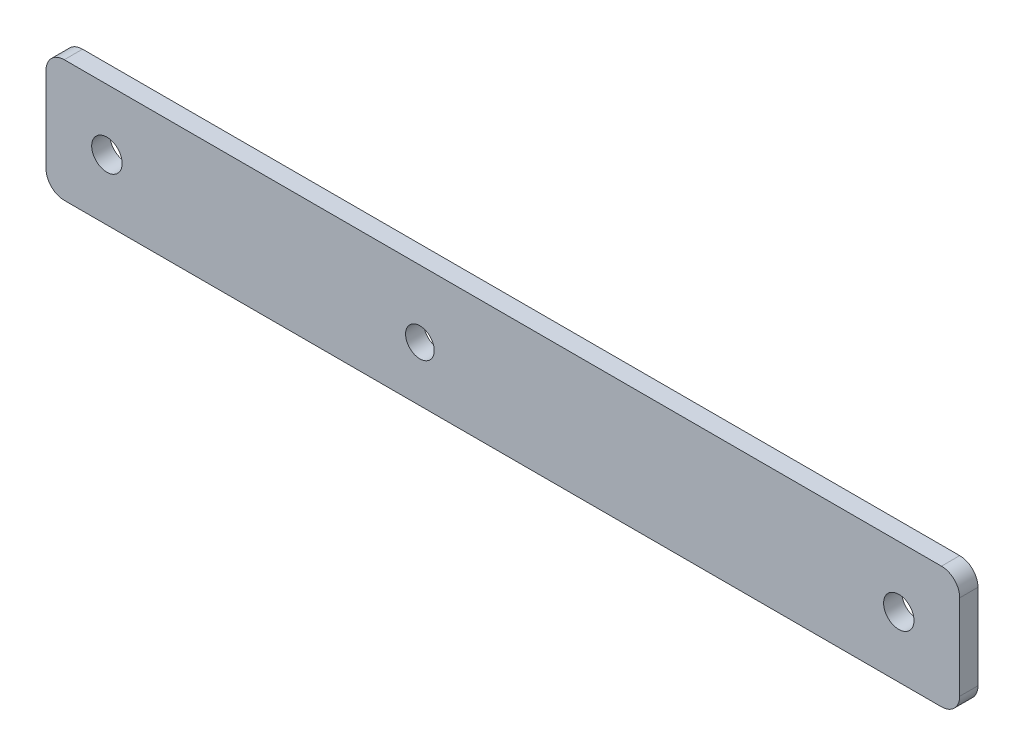
ISO-10303-21;
HEADER;
FILE_DESCRIPTION(('STEP AP214'),'2;1');
FILE_NAME('part.step','',(''),(''),'','','');
FILE_SCHEMA(('AUTOMOTIVE_DESIGN { 1 0 10303 214 1 1 1 1 }'));
ENDSEC;
DATA;
#1=APPLICATION_CONTEXT('core data for automotive mechanical design processes');
#2=APPLICATION_PROTOCOL_DEFINITION('international standard','automotive_design',2000,#1);
#3=PRODUCT_CONTEXT('',#1,'mechanical');
#4=PRODUCT('Part','Part','',(#3));
#5=PRODUCT_RELATED_PRODUCT_CATEGORY('part','',(#4));
#6=PRODUCT_DEFINITION_FORMATION('','',#4);
#7=PRODUCT_DEFINITION_CONTEXT('part definition',#1,'design');
#8=PRODUCT_DEFINITION('design','',#6,#7);
#9=PRODUCT_DEFINITION_SHAPE('','',#8);
#10=(LENGTH_UNIT() NAMED_UNIT(*) SI_UNIT(.MILLI.,.METRE.));
#11=(NAMED_UNIT(*) PLANE_ANGLE_UNIT() SI_UNIT($,.RADIAN.));
#12=(NAMED_UNIT(*) SI_UNIT($,.STERADIAN.) SOLID_ANGLE_UNIT());
#13=UNCERTAINTY_MEASURE_WITH_UNIT(LENGTH_MEASURE(1.E-05),#10,'distance_accuracy_value','');
#14=(GEOMETRIC_REPRESENTATION_CONTEXT(3) GLOBAL_UNCERTAINTY_ASSIGNED_CONTEXT((#13)) GLOBAL_UNIT_ASSIGNED_CONTEXT((#10,
#11,#12)) REPRESENTATION_CONTEXT('',''));
#15=CARTESIAN_POINT('',(0.,0.,0.));
#16=DIRECTION('',(0.,0.,1.));
#17=DIRECTION('',(1.,0.,0.));
#18=AXIS2_PLACEMENT_3D('',#15,#16,#17);
#19=CARTESIAN_POINT('',(0.,0.,3.));
#20=DIRECTION('',(0.,0.,1.));
#21=DIRECTION('',(1.,0.,0.));
#22=AXIS2_PLACEMENT_3D('',#19,#20,#21);
#23=PLANE('',#22);
#24=CARTESIAN_POINT('',(21.3812835358271,49.0134935367063,3.));
#25=DIRECTION('',(0.,0.,1.));
#26=DIRECTION('',(1.,0.,0.));
#27=AXIS2_PLACEMENT_3D('',#24,#25,#26);
#28=CIRCLE('',#27,2.35350192298621);
#29=CARTESIAN_POINT('',(23.7347854588133,49.0134935367063,3.));
#30=VERTEX_POINT('',#29);
#31=EDGE_CURVE('E192',#30,#30,#28,.T.);
#32=ORIENTED_EDGE('',*,*,#31,.F.);
#33=EDGE_LOOP('',(#32));
#34=FACE_BOUND('',#33,.T.);
#35=CARTESIAN_POINT('',(-30.,50.,3.));
#36=DIRECTION('',(0.,0.,1.));
#37=DIRECTION('',(1.,0.,0.));
#38=AXIS2_PLACEMENT_3D('',#35,#36,#37);
#39=CIRCLE('',#38,2.5);
#40=CARTESIAN_POINT('',(-27.5,50.,3.));
#41=VERTEX_POINT('',#40);
#42=EDGE_CURVE('E131',#41,#41,#39,.T.);
#43=ORIENTED_EDGE('',*,*,#42,.F.);
#44=EDGE_LOOP('',(#43));
#45=FACE_BOUND('',#44,.T.);
#46=DIRECTION('',(1.,0.,0.));
#47=VECTOR('',#46,1.);
#48=CARTESIAN_POINT('',(-40.,40.,3.));
#49=LINE('',#48,#47);
#50=CARTESIAN_POINT('',(-37.,40.,3.));
#51=VERTEX_POINT('',#50);
#52=CARTESIAN_POINT('',(107.,40.,3.));
#53=VERTEX_POINT('',#52);
#54=EDGE_CURVE('E140',#51,#53,#49,.T.);
#55=ORIENTED_EDGE('',*,*,#54,.T.);
#56=CARTESIAN_POINT('',(107.,43.,3.));
#57=DIRECTION('',(0.,0.,1.));
#58=DIRECTION('',(1.,0.,0.));
#59=AXIS2_PLACEMENT_3D('',#56,#57,#58);
#60=CIRCLE('',#59,3.);
#61=CARTESIAN_POINT('',(110.,43.,3.));
#62=VERTEX_POINT('',#61);
#63=EDGE_CURVE('E159',#53,#62,#60,.T.);
#64=ORIENTED_EDGE('',*,*,#63,.T.);
#65=DIRECTION('',(0.,1.,0.));
#66=VECTOR('',#65,1.);
#67=CARTESIAN_POINT('',(110.,60.,3.));
#68=LINE('',#67,#66);
#69=CARTESIAN_POINT('',(110.,57.,3.));
#70=VERTEX_POINT('',#69);
#71=EDGE_CURVE('E123',#62,#70,#68,.T.);
#72=ORIENTED_EDGE('',*,*,#71,.T.);
#73=CARTESIAN_POINT('',(107.,57.,3.));
#74=DIRECTION('',(0.,0.,1.));
#75=DIRECTION('',(1.,0.,0.));
#76=AXIS2_PLACEMENT_3D('',#73,#74,#75);
#77=CIRCLE('',#76,3.);
#78=CARTESIAN_POINT('',(107.,60.,3.));
#79=VERTEX_POINT('',#78);
#80=EDGE_CURVE('E157',#70,#79,#77,.T.);
#81=ORIENTED_EDGE('',*,*,#80,.T.);
#82=DIRECTION('',(-1.,0.,0.));
#83=VECTOR('',#82,1.);
#84=CARTESIAN_POINT('',(-40.,60.,3.));
#85=LINE('',#84,#83);
#86=CARTESIAN_POINT('',(-37.,60.,3.));
#87=VERTEX_POINT('',#86);
#88=EDGE_CURVE('E180',#79,#87,#85,.T.);
#89=ORIENTED_EDGE('',*,*,#88,.T.);
#90=CARTESIAN_POINT('',(-37.,57.,3.));
#91=DIRECTION('',(0.,0.,1.));
#92=DIRECTION('',(1.,0.,0.));
#93=AXIS2_PLACEMENT_3D('',#90,#91,#92);
#94=CIRCLE('',#93,3.);
#95=CARTESIAN_POINT('',(-40.,57.,3.));
#96=VERTEX_POINT('',#95);
#97=EDGE_CURVE('E58',#87,#96,#94,.T.);
#98=ORIENTED_EDGE('',*,*,#97,.T.);
#99=DIRECTION('',(0.,-1.,0.));
#100=VECTOR('',#99,1.);
#101=CARTESIAN_POINT('',(-40.,60.,3.));
#102=LINE('',#101,#100);
#103=CARTESIAN_POINT('',(-40.,43.,3.));
#104=VERTEX_POINT('',#103);
#105=EDGE_CURVE('E170',#96,#104,#102,.T.);
#106=ORIENTED_EDGE('',*,*,#105,.T.);
#107=CARTESIAN_POINT('',(-37.,43.,3.));
#108=DIRECTION('',(0.,0.,1.));
#109=DIRECTION('',(1.,0.,0.));
#110=AXIS2_PLACEMENT_3D('',#107,#108,#109);
#111=CIRCLE('',#110,3.);
#112=EDGE_CURVE('E155',#104,#51,#111,.T.);
#113=ORIENTED_EDGE('',*,*,#112,.T.);
#114=EDGE_LOOP('',(#55,#64,#72,#81,#89,#98,#106,#113));
#115=FACE_BOUND('',#114,.T.);
#116=CARTESIAN_POINT('',(99.9999999999999,50.,3.));
#117=DIRECTION('',(0.,0.,1.));
#118=DIRECTION('',(1.,0.,0.));
#119=AXIS2_PLACEMENT_3D('',#116,#117,#118);
#120=CIRCLE('',#119,2.5);
#121=CARTESIAN_POINT('',(102.5,50.,3.));
#122=VERTEX_POINT('',#121);
#123=EDGE_CURVE('E185',#122,#122,#120,.T.);
#124=ORIENTED_EDGE('',*,*,#123,.F.);
#125=EDGE_LOOP('',(#124));
#126=FACE_BOUND('',#125,.T.);
#127=ADVANCED_FACE('F37',(#34,#45,#115,#126),#23,.T.);
#128=CARTESIAN_POINT('',(0.,0.,0.));
#129=DIRECTION('',(0.,0.,1.));
#130=DIRECTION('',(1.,0.,0.));
#131=AXIS2_PLACEMENT_3D('',#128,#129,#130);
#132=PLANE('',#131);
#133=CARTESIAN_POINT('',(21.3812835358271,49.0134935367063,0.));
#134=DIRECTION('',(0.,0.,1.));
#135=DIRECTION('',(1.,0.,0.));
#136=AXIS2_PLACEMENT_3D('',#133,#134,#135);
#137=CIRCLE('',#136,2.35350192298621);
#138=CARTESIAN_POINT('',(23.7347854588133,49.0134935367063,0.));
#139=VERTEX_POINT('',#138);
#140=EDGE_CURVE('E41',#139,#139,#137,.T.);
#141=ORIENTED_EDGE('',*,*,#140,.T.);
#142=EDGE_LOOP('',(#141));
#143=FACE_BOUND('',#142,.T.);
#144=DIRECTION('',(0.,1.,0.));
#145=VECTOR('',#144,1.);
#146=CARTESIAN_POINT('',(110.,60.,0.));
#147=LINE('',#146,#145);
#148=CARTESIAN_POINT('',(110.,43.,0.));
#149=VERTEX_POINT('',#148);
#150=CARTESIAN_POINT('',(110.,57.,0.));
#151=VERTEX_POINT('',#150);
#152=EDGE_CURVE('E120',#149,#151,#147,.T.);
#153=ORIENTED_EDGE('',*,*,#152,.F.);
#154=CARTESIAN_POINT('',(107.,43.,0.));
#155=DIRECTION('',(0.,0.,1.));
#156=DIRECTION('',(1.,0.,0.));
#157=AXIS2_PLACEMENT_3D('',#154,#155,#156);
#158=CIRCLE('',#157,3.);
#159=CARTESIAN_POINT('',(107.,40.,0.));
#160=VERTEX_POINT('',#159);
#161=EDGE_CURVE('E103',#149,#160,#158,.F.);
#162=ORIENTED_EDGE('',*,*,#161,.T.);
#163=DIRECTION('',(1.,0.,0.));
#164=VECTOR('',#163,1.);
#165=CARTESIAN_POINT('',(-40.,40.,0.));
#166=LINE('',#165,#164);
#167=CARTESIAN_POINT('',(-37.,40.,0.));
#168=VERTEX_POINT('',#167);
#169=EDGE_CURVE('E144',#168,#160,#166,.T.);
#170=ORIENTED_EDGE('',*,*,#169,.F.);
#171=CARTESIAN_POINT('',(-37.,43.,0.));
#172=DIRECTION('',(0.,0.,1.));
#173=DIRECTION('',(1.,0.,0.));
#174=AXIS2_PLACEMENT_3D('',#171,#172,#173);
#175=CIRCLE('',#174,3.);
#176=CARTESIAN_POINT('',(-40.,43.,0.));
#177=VERTEX_POINT('',#176);
#178=EDGE_CURVE('E148',#168,#177,#175,.F.);
#179=ORIENTED_EDGE('',*,*,#178,.T.);
#180=DIRECTION('',(0.,-1.,0.));
#181=VECTOR('',#180,1.);
#182=CARTESIAN_POINT('',(-40.,60.,0.));
#183=LINE('',#182,#181);
#184=CARTESIAN_POINT('',(-40.,57.,0.));
#185=VERTEX_POINT('',#184);
#186=EDGE_CURVE('E134',#185,#177,#183,.T.);
#187=ORIENTED_EDGE('',*,*,#186,.F.);
#188=CARTESIAN_POINT('',(-37.,57.,0.));
#189=DIRECTION('',(0.,0.,1.));
#190=DIRECTION('',(1.,0.,0.));
#191=AXIS2_PLACEMENT_3D('',#188,#189,#190);
#192=CIRCLE('',#191,3.);
#193=CARTESIAN_POINT('',(-37.,60.,0.));
#194=VERTEX_POINT('',#193);
#195=EDGE_CURVE('E124',#185,#194,#192,.F.);
#196=ORIENTED_EDGE('',*,*,#195,.T.);
#197=DIRECTION('',(-1.,0.,0.));
#198=VECTOR('',#197,1.);
#199=CARTESIAN_POINT('',(-40.,60.,0.));
#200=LINE('',#199,#198);
#201=CARTESIAN_POINT('',(107.,60.,0.));
#202=VERTEX_POINT('',#201);
#203=EDGE_CURVE('E130',#202,#194,#200,.T.);
#204=ORIENTED_EDGE('',*,*,#203,.F.);
#205=CARTESIAN_POINT('',(107.,57.,0.));
#206=DIRECTION('',(0.,0.,1.));
#207=DIRECTION('',(1.,0.,0.));
#208=AXIS2_PLACEMENT_3D('',#205,#206,#207);
#209=CIRCLE('',#208,3.);
#210=EDGE_CURVE('E114',#202,#151,#209,.F.);
#211=ORIENTED_EDGE('',*,*,#210,.T.);
#212=EDGE_LOOP('',(#153,#162,#170,#179,#187,#196,#204,#211));
#213=FACE_BOUND('',#212,.T.);
#214=CARTESIAN_POINT('',(-30.,50.,0.));
#215=DIRECTION('',(0.,0.,1.));
#216=DIRECTION('',(1.,0.,0.));
#217=AXIS2_PLACEMENT_3D('',#214,#215,#216);
#218=CIRCLE('',#217,2.5);
#219=CARTESIAN_POINT('',(-27.5,50.,0.));
#220=VERTEX_POINT('',#219);
#221=EDGE_CURVE('E137',#220,#220,#218,.T.);
#222=ORIENTED_EDGE('',*,*,#221,.T.);
#223=EDGE_LOOP('',(#222));
#224=FACE_BOUND('',#223,.T.);
#225=CARTESIAN_POINT('',(99.9999999999999,50.,0.));
#226=DIRECTION('',(0.,0.,1.));
#227=DIRECTION('',(1.,0.,0.));
#228=AXIS2_PLACEMENT_3D('',#225,#226,#227);
#229=CIRCLE('',#228,2.5);
#230=CARTESIAN_POINT('',(102.5,50.,0.));
#231=VERTEX_POINT('',#230);
#232=EDGE_CURVE('E187',#231,#231,#229,.T.);
#233=ORIENTED_EDGE('',*,*,#232,.T.);
#234=EDGE_LOOP('',(#233));
#235=FACE_BOUND('',#234,.T.);
#236=ADVANCED_FACE('F127',(#143,#213,#224,#235),#132,.F.);
#237=CARTESIAN_POINT('',(110.,60.,3.));
#238=DIRECTION('',(-1.,0.,0.));
#239=DIRECTION('',(0.,0.,1.));
#240=AXIS2_PLACEMENT_3D('',#237,#238,#239);
#241=PLANE('',#240);
#242=ORIENTED_EDGE('',*,*,#71,.F.);
#243=DIRECTION('',(0.,0.,-1.));
#244=VECTOR('',#243,1.);
#245=CARTESIAN_POINT('',(110.,43.,3.));
#246=LINE('',#245,#244);
#247=EDGE_CURVE('E107',#62,#149,#246,.T.);
#248=ORIENTED_EDGE('',*,*,#247,.T.);
#249=ORIENTED_EDGE('',*,*,#152,.T.);
#250=DIRECTION('',(0.,0.,-1.));
#251=VECTOR('',#250,1.);
#252=CARTESIAN_POINT('',(110.,57.,3.));
#253=LINE('',#252,#251);
#254=EDGE_CURVE('E125',#151,#70,#253,.F.);
#255=ORIENTED_EDGE('',*,*,#254,.T.);
#256=EDGE_LOOP('',(#242,#248,#249,#255));
#257=FACE_BOUND('',#256,.T.);
#258=ADVANCED_FACE('F119',(#257),#241,.F.);
#259=CARTESIAN_POINT('',(-40.,60.,3.));
#260=DIRECTION('',(0.,-1.,0.));
#261=DIRECTION('',(0.,0.,-1.));
#262=AXIS2_PLACEMENT_3D('',#259,#260,#261);
#263=PLANE('',#262);
#264=ORIENTED_EDGE('',*,*,#88,.F.);
#265=DIRECTION('',(0.,0.,-1.));
#266=VECTOR('',#265,1.);
#267=CARTESIAN_POINT('',(107.,60.,3.));
#268=LINE('',#267,#266);
#269=EDGE_CURVE('E163',#79,#202,#268,.T.);
#270=ORIENTED_EDGE('',*,*,#269,.T.);
#271=ORIENTED_EDGE('',*,*,#203,.T.);
#272=DIRECTION('',(0.,0.,-1.));
#273=VECTOR('',#272,1.);
#274=CARTESIAN_POINT('',(-37.,60.,3.));
#275=LINE('',#274,#273);
#276=EDGE_CURVE('E161',#194,#87,#275,.F.);
#277=ORIENTED_EDGE('',*,*,#276,.T.);
#278=EDGE_LOOP('',(#264,#270,#271,#277));
#279=FACE_BOUND('',#278,.T.);
#280=ADVANCED_FACE('F223',(#279),#263,.F.);
#281=CARTESIAN_POINT('',(-40.,60.,3.));
#282=DIRECTION('',(1.,0.,0.));
#283=DIRECTION('',(0.,1.,0.));
#284=AXIS2_PLACEMENT_3D('',#281,#282,#283);
#285=PLANE('',#284);
#286=ORIENTED_EDGE('',*,*,#186,.T.);
#287=DIRECTION('',(0.,0.,-1.));
#288=VECTOR('',#287,1.);
#289=CARTESIAN_POINT('',(-40.,43.,3.));
#290=LINE('',#289,#288);
#291=EDGE_CURVE('E11',#177,#104,#290,.F.);
#292=ORIENTED_EDGE('',*,*,#291,.T.);
#293=ORIENTED_EDGE('',*,*,#105,.F.);
#294=DIRECTION('',(0.,0.,-1.));
#295=VECTOR('',#294,1.);
#296=CARTESIAN_POINT('',(-40.,57.,3.));
#297=LINE('',#296,#295);
#298=EDGE_CURVE('E46',#96,#185,#297,.T.);
#299=ORIENTED_EDGE('',*,*,#298,.T.);
#300=EDGE_LOOP('',(#286,#292,#293,#299));
#301=FACE_BOUND('',#300,.T.);
#302=ADVANCED_FACE('F169',(#301),#285,.F.);
#303=CARTESIAN_POINT('',(-40.,40.,3.));
#304=DIRECTION('',(0.,1.,0.));
#305=DIRECTION('',(0.,0.,1.));
#306=AXIS2_PLACEMENT_3D('',#303,#304,#305);
#307=PLANE('',#306);
#308=ORIENTED_EDGE('',*,*,#169,.T.);
#309=DIRECTION('',(0.,0.,-1.));
#310=VECTOR('',#309,1.);
#311=CARTESIAN_POINT('',(107.,40.,3.));
#312=LINE('',#311,#310);
#313=EDGE_CURVE('E108',#160,#53,#312,.F.);
#314=ORIENTED_EDGE('',*,*,#313,.T.);
#315=ORIENTED_EDGE('',*,*,#54,.F.);
#316=DIRECTION('',(0.,0.,-1.));
#317=VECTOR('',#316,1.);
#318=CARTESIAN_POINT('',(-37.,40.,3.));
#319=LINE('',#318,#317);
#320=EDGE_CURVE('E113',#51,#168,#319,.T.);
#321=ORIENTED_EDGE('',*,*,#320,.T.);
#322=EDGE_LOOP('',(#308,#314,#315,#321));
#323=FACE_BOUND('',#322,.T.);
#324=ADVANCED_FACE('F178',(#323),#307,.F.);
#325=CARTESIAN_POINT('',(-30.,50.,3.));
#326=DIRECTION('',(0.,0.,-1.));
#327=DIRECTION('',(-1.,0.,0.));
#328=AXIS2_PLACEMENT_3D('',#325,#326,#327);
#329=CYLINDRICAL_SURFACE('',#328,2.5);
#330=ORIENTED_EDGE('',*,*,#42,.T.);
#331=EDGE_LOOP('',(#330));
#332=FACE_BOUND('',#331,.T.);
#333=ORIENTED_EDGE('',*,*,#221,.F.);
#334=EDGE_LOOP('',(#333));
#335=FACE_BOUND('',#334,.T.);
#336=ADVANCED_FACE('F217',(#332,#335),#329,.F.);
#337=CARTESIAN_POINT('',(99.9999999999999,50.,3.));
#338=DIRECTION('',(0.,0.,-1.));
#339=DIRECTION('',(-1.,0.,0.));
#340=AXIS2_PLACEMENT_3D('',#337,#338,#339);
#341=CYLINDRICAL_SURFACE('',#340,2.5);
#342=ORIENTED_EDGE('',*,*,#123,.T.);
#343=EDGE_LOOP('',(#342));
#344=FACE_BOUND('',#343,.T.);
#345=ORIENTED_EDGE('',*,*,#232,.F.);
#346=EDGE_LOOP('',(#345));
#347=FACE_BOUND('',#346,.T.);
#348=ADVANCED_FACE('F232',(#344,#347),#341,.F.);
#349=CARTESIAN_POINT('',(107.,43.,3.));
#350=DIRECTION('',(0.,0.,-1.));
#351=DIRECTION('',(-1.,0.,0.));
#352=AXIS2_PLACEMENT_3D('',#349,#350,#351);
#353=CYLINDRICAL_SURFACE('',#352,3.);
#354=ORIENTED_EDGE('',*,*,#63,.F.);
#355=ORIENTED_EDGE('',*,*,#313,.F.);
#356=ORIENTED_EDGE('',*,*,#161,.F.);
#357=ORIENTED_EDGE('',*,*,#247,.F.);
#358=EDGE_LOOP('',(#354,#355,#356,#357));
#359=FACE_BOUND('',#358,.T.);
#360=ADVANCED_FACE('F106',(#359),#353,.T.);
#361=CARTESIAN_POINT('',(107.,57.,3.));
#362=DIRECTION('',(0.,0.,-1.));
#363=DIRECTION('',(-1.,0.,0.));
#364=AXIS2_PLACEMENT_3D('',#361,#362,#363);
#365=CYLINDRICAL_SURFACE('',#364,3.);
#366=ORIENTED_EDGE('',*,*,#80,.F.);
#367=ORIENTED_EDGE('',*,*,#254,.F.);
#368=ORIENTED_EDGE('',*,*,#210,.F.);
#369=ORIENTED_EDGE('',*,*,#269,.F.);
#370=EDGE_LOOP('',(#366,#367,#368,#369));
#371=FACE_BOUND('',#370,.T.);
#372=ADVANCED_FACE('F231',(#371),#365,.T.);
#373=CARTESIAN_POINT('',(-37.,43.,3.));
#374=DIRECTION('',(0.,0.,-1.));
#375=DIRECTION('',(-1.,0.,0.));
#376=AXIS2_PLACEMENT_3D('',#373,#374,#375);
#377=CYLINDRICAL_SURFACE('',#376,3.);
#378=ORIENTED_EDGE('',*,*,#112,.F.);
#379=ORIENTED_EDGE('',*,*,#291,.F.);
#380=ORIENTED_EDGE('',*,*,#178,.F.);
#381=ORIENTED_EDGE('',*,*,#320,.F.);
#382=EDGE_LOOP('',(#378,#379,#380,#381));
#383=FACE_BOUND('',#382,.T.);
#384=ADVANCED_FACE('F175',(#383),#377,.T.);
#385=CARTESIAN_POINT('',(-37.,57.,3.));
#386=DIRECTION('',(0.,0.,-1.));
#387=DIRECTION('',(-1.,0.,0.));
#388=AXIS2_PLACEMENT_3D('',#385,#386,#387);
#389=CYLINDRICAL_SURFACE('',#388,3.);
#390=ORIENTED_EDGE('',*,*,#97,.F.);
#391=ORIENTED_EDGE('',*,*,#276,.F.);
#392=ORIENTED_EDGE('',*,*,#195,.F.);
#393=ORIENTED_EDGE('',*,*,#298,.F.);
#394=EDGE_LOOP('',(#390,#391,#392,#393));
#395=FACE_BOUND('',#394,.T.);
#396=ADVANCED_FACE('F39',(#395),#389,.T.);
#397=CARTESIAN_POINT('',(21.3812835358271,49.0134935367063,-105.));
#398=DIRECTION('',(0.,0.,1.));
#399=DIRECTION('',(1.,0.,0.));
#400=AXIS2_PLACEMENT_3D('',#397,#398,#399);
#401=CYLINDRICAL_SURFACE('',#400,2.35350192298621);
#402=ORIENTED_EDGE('',*,*,#31,.T.);
#403=EDGE_LOOP('',(#402));
#404=FACE_BOUND('',#403,.T.);
#405=ORIENTED_EDGE('',*,*,#140,.F.);
#406=EDGE_LOOP('',(#405));
#407=FACE_BOUND('',#406,.T.);
#408=ADVANCED_FACE('F200',(#404,#407),#401,.F.);
#409=CLOSED_SHELL('',(#127,#236,#258,#280,#302,#324,#336,#348,#360,#372,#384,#396,#408));
#410=MANIFOLD_SOLID_BREP('B2',#409);
#411=ADVANCED_BREP_SHAPE_REPRESENTATION('',(#18,#410),#14);
#412=SHAPE_DEFINITION_REPRESENTATION(#9,#411);
ENDSEC;
END-ISO-10303-21;
